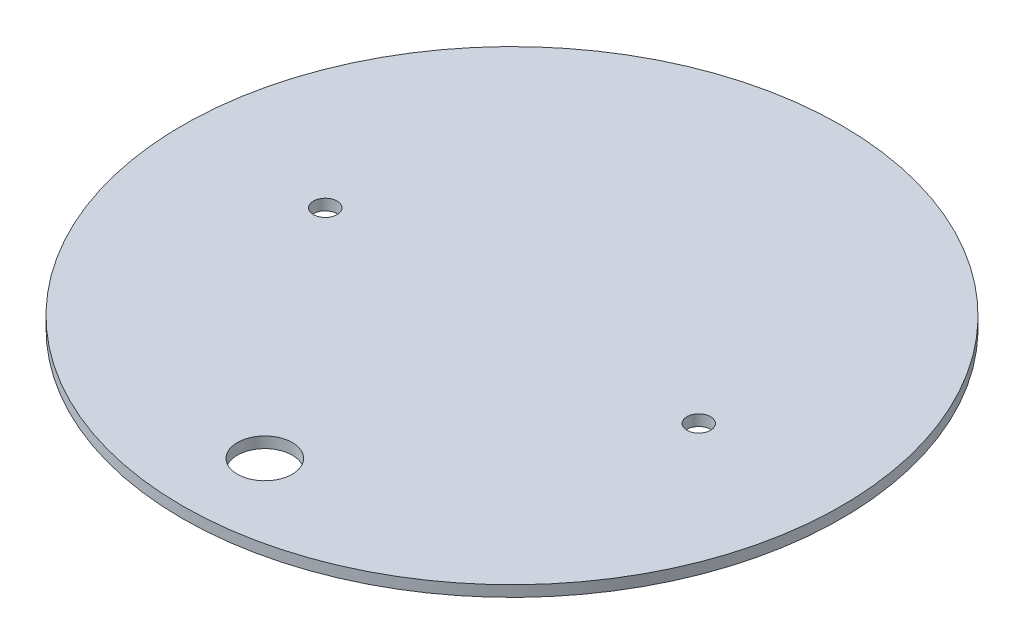
ISO-10303-21;
HEADER;
FILE_DESCRIPTION(('STEP AP214'),'2;1');
FILE_NAME('part.step','',(''),(''),'','','');
FILE_SCHEMA(('AUTOMOTIVE_DESIGN { 1 0 10303 214 1 1 1 1 }'));
ENDSEC;
DATA;
#1=APPLICATION_CONTEXT('core data for automotive mechanical design processes');
#2=APPLICATION_PROTOCOL_DEFINITION('international standard','automotive_design',2000,#1);
#3=PRODUCT_CONTEXT('',#1,'mechanical');
#4=PRODUCT('Part','Part','',(#3));
#5=PRODUCT_RELATED_PRODUCT_CATEGORY('part','',(#4));
#6=PRODUCT_DEFINITION_FORMATION('','',#4);
#7=PRODUCT_DEFINITION_CONTEXT('part definition',#1,'design');
#8=PRODUCT_DEFINITION('design','',#6,#7);
#9=PRODUCT_DEFINITION_SHAPE('','',#8);
#10=(LENGTH_UNIT() NAMED_UNIT(*) SI_UNIT(.MILLI.,.METRE.));
#11=(NAMED_UNIT(*) PLANE_ANGLE_UNIT() SI_UNIT($,.RADIAN.));
#12=(NAMED_UNIT(*) SI_UNIT($,.STERADIAN.) SOLID_ANGLE_UNIT());
#13=UNCERTAINTY_MEASURE_WITH_UNIT(LENGTH_MEASURE(1.E-05),#10,'distance_accuracy_value','');
#14=(GEOMETRIC_REPRESENTATION_CONTEXT(3) GLOBAL_UNCERTAINTY_ASSIGNED_CONTEXT((#13)) GLOBAL_UNIT_ASSIGNED_CONTEXT((#10,
#11,#12)) REPRESENTATION_CONTEXT('',''));
#15=CARTESIAN_POINT('',(0.,0.,0.));
#16=DIRECTION('',(0.,0.,1.));
#17=DIRECTION('',(1.,0.,0.));
#18=AXIS2_PLACEMENT_3D('',#15,#16,#17);
#19=CARTESIAN_POINT('',(0.,2.,0.));
#20=DIRECTION('',(0.,1.,0.));
#21=DIRECTION('',(0.,0.,1.));
#22=AXIS2_PLACEMENT_3D('',#19,#20,#21);
#23=PLANE('',#22);
#24=CARTESIAN_POINT('',(34.,2.,0.));
#25=DIRECTION('',(0.,1.,0.));
#26=DIRECTION('',(0.,0.,1.));
#27=AXIS2_PLACEMENT_3D('',#24,#25,#26);
#28=CIRCLE('',#27,2.15);
#29=CARTESIAN_POINT('',(34.,2.,2.15));
#30=VERTEX_POINT('',#29);
#31=EDGE_CURVE('E46',#30,#30,#28,.T.);
#32=ORIENTED_EDGE('',*,*,#31,.F.);
#33=EDGE_LOOP('',(#32));
#34=FACE_BOUND('',#33,.T.);
#35=CARTESIAN_POINT('',(0.,2.,0.));
#36=DIRECTION('',(0.,1.,0.));
#37=DIRECTION('',(0.,0.,1.));
#38=AXIS2_PLACEMENT_3D('',#35,#36,#37);
#39=CIRCLE('',#38,60.);
#40=CARTESIAN_POINT('',(0.,2.,60.));
#41=VERTEX_POINT('',#40);
#42=EDGE_CURVE('E10',#41,#41,#39,.T.);
#43=ORIENTED_EDGE('',*,*,#42,.T.);
#44=EDGE_LOOP('',(#43));
#45=FACE_BOUND('',#44,.T.);
#46=CARTESIAN_POINT('',(-34.,2.,0.));
#47=DIRECTION('',(0.,1.,0.));
#48=DIRECTION('',(0.,0.,1.));
#49=AXIS2_PLACEMENT_3D('',#46,#47,#48);
#50=CIRCLE('',#49,2.15);
#51=CARTESIAN_POINT('',(-34.,2.,2.15));
#52=VERTEX_POINT('',#51);
#53=EDGE_CURVE('E41',#52,#52,#50,.T.);
#54=ORIENTED_EDGE('',*,*,#53,.F.);
#55=EDGE_LOOP('',(#54));
#56=FACE_BOUND('',#55,.T.);
#57=CARTESIAN_POINT('',(0.,2.,45.));
#58=DIRECTION('',(0.,1.,0.));
#59=DIRECTION('',(0.,0.,1.));
#60=AXIS2_PLACEMENT_3D('',#57,#58,#59);
#61=CIRCLE('',#60,5.);
#62=CARTESIAN_POINT('',(0.,2.,50.));
#63=VERTEX_POINT('',#62);
#64=EDGE_CURVE('E52',#63,#63,#61,.T.);
#65=ORIENTED_EDGE('',*,*,#64,.F.);
#66=EDGE_LOOP('',(#65));
#67=FACE_BOUND('',#66,.T.);
#68=ADVANCED_FACE('F30',(#34,#45,#56,#67),#23,.T.);
#69=CARTESIAN_POINT('',(0.,0.,0.));
#70=DIRECTION('',(0.,1.,0.));
#71=DIRECTION('',(0.,0.,1.));
#72=AXIS2_PLACEMENT_3D('',#69,#70,#71);
#73=PLANE('',#72);
#74=CARTESIAN_POINT('',(0.,0.,0.));
#75=DIRECTION('',(0.,1.,0.));
#76=DIRECTION('',(0.,0.,1.));
#77=AXIS2_PLACEMENT_3D('',#74,#75,#76);
#78=CIRCLE('',#77,60.);
#79=CARTESIAN_POINT('',(0.,0.,60.));
#80=VERTEX_POINT('',#79);
#81=EDGE_CURVE('E34',#80,#80,#78,.T.);
#82=ORIENTED_EDGE('',*,*,#81,.F.);
#83=EDGE_LOOP('',(#82));
#84=FACE_BOUND('',#83,.T.);
#85=CARTESIAN_POINT('',(-34.,0.,0.));
#86=DIRECTION('',(0.,1.,0.));
#87=DIRECTION('',(0.,0.,1.));
#88=AXIS2_PLACEMENT_3D('',#85,#86,#87);
#89=CIRCLE('',#88,2.15);
#90=CARTESIAN_POINT('',(-34.,0.,2.15));
#91=VERTEX_POINT('',#90);
#92=EDGE_CURVE('E43',#91,#91,#89,.T.);
#93=ORIENTED_EDGE('',*,*,#92,.T.);
#94=EDGE_LOOP('',(#93));
#95=FACE_BOUND('',#94,.T.);
#96=CARTESIAN_POINT('',(34.,0.,0.));
#97=DIRECTION('',(0.,1.,0.));
#98=DIRECTION('',(0.,0.,1.));
#99=AXIS2_PLACEMENT_3D('',#96,#97,#98);
#100=CIRCLE('',#99,2.15);
#101=CARTESIAN_POINT('',(34.,0.,2.15));
#102=VERTEX_POINT('',#101);
#103=EDGE_CURVE('E49',#102,#102,#100,.T.);
#104=ORIENTED_EDGE('',*,*,#103,.T.);
#105=EDGE_LOOP('',(#104));
#106=FACE_BOUND('',#105,.T.);
#107=CARTESIAN_POINT('',(0.,0.,45.));
#108=DIRECTION('',(0.,1.,0.));
#109=DIRECTION('',(0.,0.,1.));
#110=AXIS2_PLACEMENT_3D('',#107,#108,#109);
#111=CIRCLE('',#110,5.);
#112=CARTESIAN_POINT('',(0.,0.,50.));
#113=VERTEX_POINT('',#112);
#114=EDGE_CURVE('E55',#113,#113,#111,.T.);
#115=ORIENTED_EDGE('',*,*,#114,.T.);
#116=EDGE_LOOP('',(#115));
#117=FACE_BOUND('',#116,.T.);
#118=ADVANCED_FACE('F65',(#84,#95,#106,#117),#73,.F.);
#119=CARTESIAN_POINT('',(0.,2.,0.));
#120=DIRECTION('',(0.,-1.,0.));
#121=DIRECTION('',(0.,0.,-1.));
#122=AXIS2_PLACEMENT_3D('',#119,#120,#121);
#123=CYLINDRICAL_SURFACE('',#122,60.);
#124=ORIENTED_EDGE('',*,*,#42,.F.);
#125=EDGE_LOOP('',(#124));
#126=FACE_BOUND('',#125,.T.);
#127=ORIENTED_EDGE('',*,*,#81,.T.);
#128=EDGE_LOOP('',(#127));
#129=FACE_BOUND('',#128,.T.);
#130=ADVANCED_FACE('F32',(#126,#129),#123,.T.);
#131=CARTESIAN_POINT('',(-34.,2.,0.));
#132=DIRECTION('',(0.,-1.,0.));
#133=DIRECTION('',(0.,0.,-1.));
#134=AXIS2_PLACEMENT_3D('',#131,#132,#133);
#135=CYLINDRICAL_SURFACE('',#134,2.15);
#136=ORIENTED_EDGE('',*,*,#53,.T.);
#137=EDGE_LOOP('',(#136));
#138=FACE_BOUND('',#137,.T.);
#139=ORIENTED_EDGE('',*,*,#92,.F.);
#140=EDGE_LOOP('',(#139));
#141=FACE_BOUND('',#140,.T.);
#142=ADVANCED_FACE('F74',(#138,#141),#135,.F.);
#143=CARTESIAN_POINT('',(34.,2.,0.));
#144=DIRECTION('',(0.,-1.,0.));
#145=DIRECTION('',(0.,0.,-1.));
#146=AXIS2_PLACEMENT_3D('',#143,#144,#145);
#147=CYLINDRICAL_SURFACE('',#146,2.15);
#148=ORIENTED_EDGE('',*,*,#31,.T.);
#149=EDGE_LOOP('',(#148));
#150=FACE_BOUND('',#149,.T.);
#151=ORIENTED_EDGE('',*,*,#103,.F.);
#152=EDGE_LOOP('',(#151));
#153=FACE_BOUND('',#152,.T.);
#154=ADVANCED_FACE('F77',(#150,#153),#147,.F.);
#155=CARTESIAN_POINT('',(0.,2.,45.));
#156=DIRECTION('',(0.,-1.,0.));
#157=DIRECTION('',(0.,0.,-1.));
#158=AXIS2_PLACEMENT_3D('',#155,#156,#157);
#159=CYLINDRICAL_SURFACE('',#158,5.);
#160=ORIENTED_EDGE('',*,*,#64,.T.);
#161=EDGE_LOOP('',(#160));
#162=FACE_BOUND('',#161,.T.);
#163=ORIENTED_EDGE('',*,*,#114,.F.);
#164=EDGE_LOOP('',(#163));
#165=FACE_BOUND('',#164,.T.);
#166=ADVANCED_FACE('F61',(#162,#165),#159,.F.);
#167=CLOSED_SHELL('',(#68,#118,#130,#142,#154,#166));
#168=MANIFOLD_SOLID_BREP('B2',#167);
#169=ADVANCED_BREP_SHAPE_REPRESENTATION('',(#18,#168),#14);
#170=SHAPE_DEFINITION_REPRESENTATION(#9,#169);
ENDSEC;
END-ISO-10303-21;
